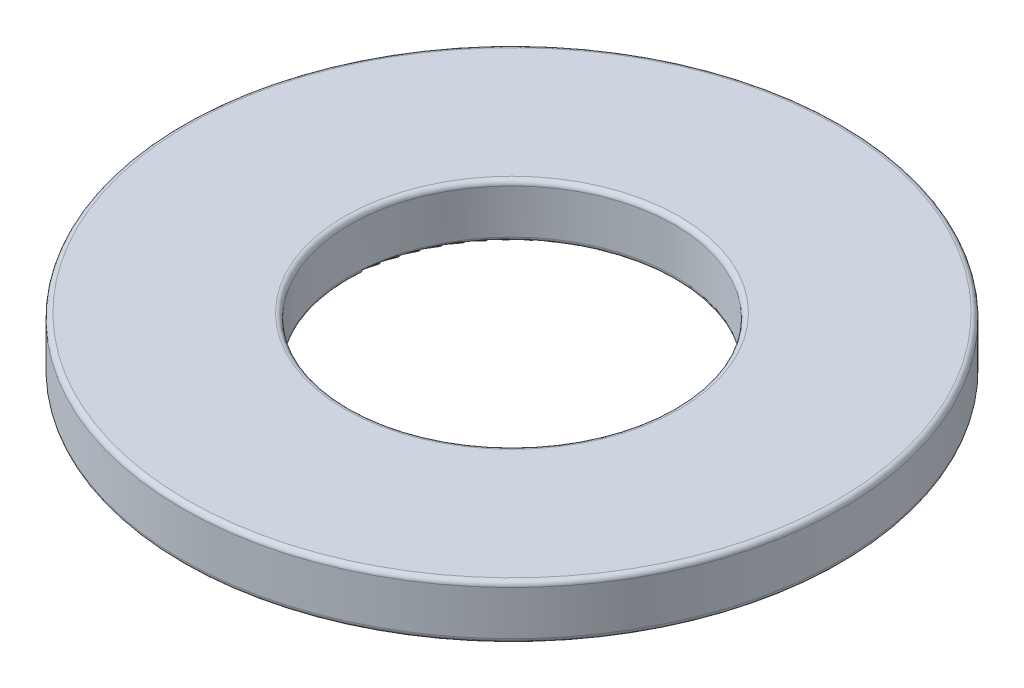
ISO-10303-21;
HEADER;
FILE_DESCRIPTION(('STEP AP214'),'2;1');
FILE_NAME('part.step','',(''),(''),'','','');
FILE_SCHEMA(('AUTOMOTIVE_DESIGN { 1 0 10303 214 1 1 1 1 }'));
ENDSEC;
DATA;
#1=APPLICATION_CONTEXT('core data for automotive mechanical design processes');
#2=APPLICATION_PROTOCOL_DEFINITION('international standard','automotive_design',2000,#1);
#3=PRODUCT_CONTEXT('',#1,'mechanical');
#4=PRODUCT('Part','Part','',(#3));
#5=PRODUCT_RELATED_PRODUCT_CATEGORY('part','',(#4));
#6=PRODUCT_DEFINITION_FORMATION('','',#4);
#7=PRODUCT_DEFINITION_CONTEXT('part definition',#1,'design');
#8=PRODUCT_DEFINITION('design','',#6,#7);
#9=PRODUCT_DEFINITION_SHAPE('','',#8);
#10=(LENGTH_UNIT() NAMED_UNIT(*) SI_UNIT(.MILLI.,.METRE.));
#11=(NAMED_UNIT(*) PLANE_ANGLE_UNIT() SI_UNIT($,.RADIAN.));
#12=(NAMED_UNIT(*) SI_UNIT($,.STERADIAN.) SOLID_ANGLE_UNIT());
#13=UNCERTAINTY_MEASURE_WITH_UNIT(LENGTH_MEASURE(1.E-05),#10,'distance_accuracy_value','');
#14=(GEOMETRIC_REPRESENTATION_CONTEXT(3) GLOBAL_UNCERTAINTY_ASSIGNED_CONTEXT((#13)) GLOBAL_UNIT_ASSIGNED_CONTEXT((#10,
#11,#12)) REPRESENTATION_CONTEXT('',''));
#15=CARTESIAN_POINT('',(0.,0.,0.));
#16=DIRECTION('',(0.,0.,1.));
#17=DIRECTION('',(1.,0.,0.));
#18=AXIS2_PLACEMENT_3D('',#15,#16,#17);
#19=CARTESIAN_POINT('',(0.,0.,0.));
#20=DIRECTION('',(0.,-1.,0.));
#21=DIRECTION('',(0.,0.,-1.));
#22=AXIS2_PLACEMENT_3D('',#19,#20,#21);
#23=CYLINDRICAL_SURFACE('',#22,1.65);
#24=CARTESIAN_POINT('',(0.,0.05,0.));
#25=DIRECTION('',(0.,-1.,0.));
#26=DIRECTION('',(0.,0.,-1.));
#27=AXIS2_PLACEMENT_3D('',#24,#25,#26);
#28=CIRCLE('',#27,1.65);
#29=CARTESIAN_POINT('',(0.,0.05,-1.65));
#30=VERTEX_POINT('',#29);
#31=EDGE_CURVE('E66',#30,#30,#28,.T.);
#32=ORIENTED_EDGE('',*,*,#31,.T.);
#33=EDGE_LOOP('',(#32));
#34=FACE_BOUND('',#33,.T.);
#35=CARTESIAN_POINT('',(0.,0.5,0.));
#36=DIRECTION('',(0.,1.,0.));
#37=DIRECTION('',(0.,0.,1.));
#38=AXIS2_PLACEMENT_3D('',#35,#36,#37);
#39=CIRCLE('',#38,1.65);
#40=CARTESIAN_POINT('',(0.,0.5,1.65));
#41=VERTEX_POINT('',#40);
#42=EDGE_CURVE('E70',#41,#41,#39,.T.);
#43=ORIENTED_EDGE('',*,*,#42,.T.);
#44=EDGE_LOOP('',(#43));
#45=FACE_BOUND('',#44,.T.);
#46=ADVANCED_FACE('F34',(#34,#45),#23,.F.);
#47=CARTESIAN_POINT('',(1.65,0.,0.));
#48=DIRECTION('',(0.,-1.,0.));
#49=DIRECTION('',(0.,0.,-1.));
#50=AXIS2_PLACEMENT_3D('',#47,#48,#49);
#51=PLANE('',#50);
#52=CARTESIAN_POINT('',(0.,0.,0.));
#53=DIRECTION('',(0.,-1.,0.));
#54=DIRECTION('',(0.,0.,-1.));
#55=AXIS2_PLACEMENT_3D('',#52,#53,#54);
#56=CIRCLE('',#55,1.7);
#57=CARTESIAN_POINT('',(0.,0.,-1.7));
#58=VERTEX_POINT('',#57);
#59=EDGE_CURVE('E59',#58,#58,#56,.F.);
#60=ORIENTED_EDGE('',*,*,#59,.T.);
#61=EDGE_LOOP('',(#60));
#62=FACE_BOUND('',#61,.T.);
#63=CARTESIAN_POINT('',(0.,0.,0.));
#64=DIRECTION('',(0.,-1.,0.));
#65=DIRECTION('',(0.,0.,-1.));
#66=AXIS2_PLACEMENT_3D('',#63,#64,#65);
#67=CIRCLE('',#66,3.3);
#68=CARTESIAN_POINT('',(0.,0.,-3.3));
#69=VERTEX_POINT('',#68);
#70=EDGE_CURVE('E63',#69,#69,#67,.T.);
#71=ORIENTED_EDGE('',*,*,#70,.T.);
#72=EDGE_LOOP('',(#71));
#73=FACE_BOUND('',#72,.T.);
#74=ADVANCED_FACE('F98',(#62,#73),#51,.T.);
#75=CARTESIAN_POINT('',(0.,0.,0.));
#76=DIRECTION('',(0.,-1.,0.));
#77=DIRECTION('',(0.,0.,-1.));
#78=AXIS2_PLACEMENT_3D('',#75,#76,#77);
#79=CYLINDRICAL_SURFACE('',#78,3.35);
#80=CARTESIAN_POINT('',(0.,0.05,0.));
#81=DIRECTION('',(0.,-1.,0.));
#82=DIRECTION('',(0.,0.,-1.));
#83=AXIS2_PLACEMENT_3D('',#80,#81,#82);
#84=CIRCLE('',#83,3.35);
#85=CARTESIAN_POINT('',(0.,0.05,-3.35));
#86=VERTEX_POINT('',#85);
#87=EDGE_CURVE('E10',#86,#86,#84,.F.);
#88=ORIENTED_EDGE('',*,*,#87,.T.);
#89=EDGE_LOOP('',(#88));
#90=FACE_BOUND('',#89,.T.);
#91=CARTESIAN_POINT('',(0.,0.5,0.));
#92=DIRECTION('',(0.,1.,0.));
#93=DIRECTION('',(0.,0.,1.));
#94=AXIS2_PLACEMENT_3D('',#91,#92,#93);
#95=CIRCLE('',#94,3.35);
#96=CARTESIAN_POINT('',(0.,0.5,3.35));
#97=VERTEX_POINT('',#96);
#98=EDGE_CURVE('E42',#97,#97,#95,.F.);
#99=ORIENTED_EDGE('',*,*,#98,.T.);
#100=EDGE_LOOP('',(#99));
#101=FACE_BOUND('',#100,.T.);
#102=ADVANCED_FACE('F87',(#90,#101),#79,.T.);
#103=CARTESIAN_POINT('',(3.35,0.55,0.));
#104=DIRECTION('',(0.,1.,0.));
#105=DIRECTION('',(0.,0.,1.));
#106=AXIS2_PLACEMENT_3D('',#103,#104,#105);
#107=PLANE('',#106);
#108=CARTESIAN_POINT('',(0.,0.55,0.));
#109=DIRECTION('',(0.,1.,0.));
#110=DIRECTION('',(0.,0.,1.));
#111=AXIS2_PLACEMENT_3D('',#108,#109,#110);
#112=CIRCLE('',#111,1.7);
#113=CARTESIAN_POINT('',(0.,0.55,1.7));
#114=VERTEX_POINT('',#113);
#115=EDGE_CURVE('E49',#114,#114,#112,.F.);
#116=ORIENTED_EDGE('',*,*,#115,.T.);
#117=EDGE_LOOP('',(#116));
#118=FACE_BOUND('',#117,.T.);
#119=CARTESIAN_POINT('',(0.,0.55,0.));
#120=DIRECTION('',(0.,1.,0.));
#121=DIRECTION('',(0.,0.,1.));
#122=AXIS2_PLACEMENT_3D('',#119,#120,#121);
#123=CIRCLE('',#122,3.3);
#124=CARTESIAN_POINT('',(0.,0.55,3.3));
#125=VERTEX_POINT('',#124);
#126=EDGE_CURVE('E54',#125,#125,#123,.T.);
#127=ORIENTED_EDGE('',*,*,#126,.T.);
#128=EDGE_LOOP('',(#127));
#129=FACE_BOUND('',#128,.T.);
#130=ADVANCED_FACE('F84',(#118,#129),#107,.T.);
#131=CARTESIAN_POINT('',(0.,0.05,0.));
#132=DIRECTION('',(0.,-1.,0.));
#133=DIRECTION('',(0.,0.,-1.));
#134=AXIS2_PLACEMENT_3D('',#131,#132,#133);
#135=TOROIDAL_SURFACE('',#134,1.7,0.05);
#136=ORIENTED_EDGE('',*,*,#59,.F.);
#137=EDGE_LOOP('',(#136));
#138=FACE_BOUND('',#137,.T.);
#139=ORIENTED_EDGE('',*,*,#31,.F.);
#140=EDGE_LOOP('',(#139));
#141=FACE_BOUND('',#140,.T.);
#142=ADVANCED_FACE('F80',(#138,#141),#135,.T.);
#143=CARTESIAN_POINT('',(0.,0.5,0.));
#144=DIRECTION('',(0.,1.,0.));
#145=DIRECTION('',(0.,0.,1.));
#146=AXIS2_PLACEMENT_3D('',#143,#144,#145);
#147=TOROIDAL_SURFACE('',#146,1.7,0.05);
#148=ORIENTED_EDGE('',*,*,#42,.F.);
#149=EDGE_LOOP('',(#148));
#150=FACE_BOUND('',#149,.T.);
#151=ORIENTED_EDGE('',*,*,#115,.F.);
#152=EDGE_LOOP('',(#151));
#153=FACE_BOUND('',#152,.T.);
#154=ADVANCED_FACE('F76',(#150,#153),#147,.T.);
#155=CARTESIAN_POINT('',(0.,0.05,0.));
#156=DIRECTION('',(0.,-1.,0.));
#157=DIRECTION('',(0.,0.,-1.));
#158=AXIS2_PLACEMENT_3D('',#155,#156,#157);
#159=TOROIDAL_SURFACE('',#158,3.3,0.05);
#160=ORIENTED_EDGE('',*,*,#87,.F.);
#161=EDGE_LOOP('',(#160));
#162=FACE_BOUND('',#161,.T.);
#163=ORIENTED_EDGE('',*,*,#70,.F.);
#164=EDGE_LOOP('',(#163));
#165=FACE_BOUND('',#164,.T.);
#166=ADVANCED_FACE('F79',(#162,#165),#159,.T.);
#167=CARTESIAN_POINT('',(0.,0.5,0.));
#168=DIRECTION('',(0.,1.,0.));
#169=DIRECTION('',(0.,0.,1.));
#170=AXIS2_PLACEMENT_3D('',#167,#168,#169);
#171=TOROIDAL_SURFACE('',#170,3.3,0.05);
#172=ORIENTED_EDGE('',*,*,#126,.F.);
#173=EDGE_LOOP('',(#172));
#174=FACE_BOUND('',#173,.T.);
#175=ORIENTED_EDGE('',*,*,#98,.F.);
#176=EDGE_LOOP('',(#175));
#177=FACE_BOUND('',#176,.T.);
#178=ADVANCED_FACE('F36',(#174,#177),#171,.T.);
#179=CLOSED_SHELL('',(#46,#74,#102,#130,#142,#154,#166,#178));
#180=MANIFOLD_SOLID_BREP('B2',#179);
#181=ADVANCED_BREP_SHAPE_REPRESENTATION('',(#18,#180),#14);
#182=SHAPE_DEFINITION_REPRESENTATION(#9,#181);
ENDSEC;
END-ISO-10303-21;
